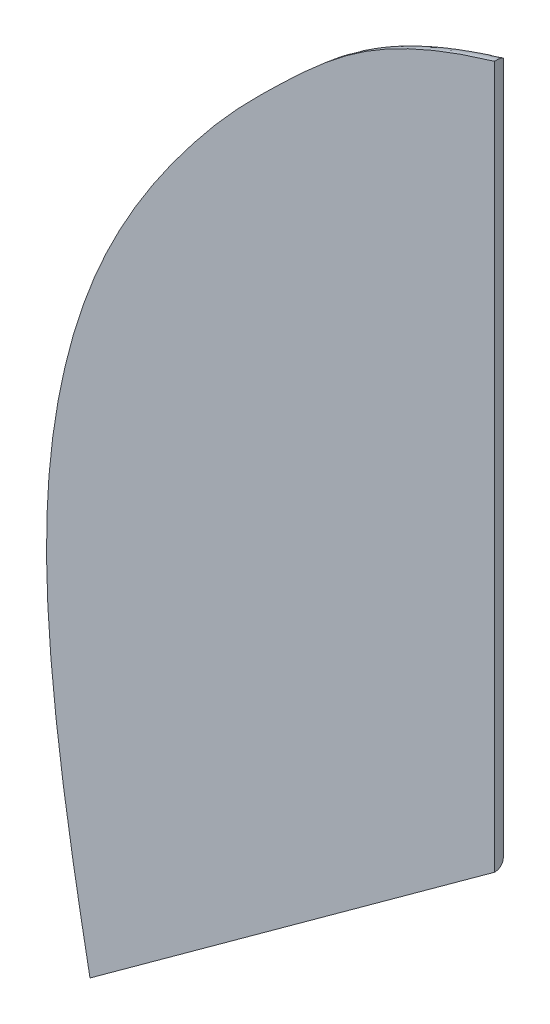
ISO-10303-21;
HEADER;
FILE_DESCRIPTION(('STEP AP214'),'2;1');
FILE_NAME('part.step','',(''),(''),'','','');
FILE_SCHEMA(('AUTOMOTIVE_DESIGN { 1 0 10303 214 1 1 1 1 }'));
ENDSEC;
DATA;
#1=APPLICATION_CONTEXT('core data for automotive mechanical design processes');
#2=APPLICATION_PROTOCOL_DEFINITION('international standard','automotive_design',2000,#1);
#3=PRODUCT_CONTEXT('',#1,'mechanical');
#4=PRODUCT('Part','Part','',(#3));
#5=PRODUCT_RELATED_PRODUCT_CATEGORY('part','',(#4));
#6=PRODUCT_DEFINITION_FORMATION('','',#4);
#7=PRODUCT_DEFINITION_CONTEXT('part definition',#1,'design');
#8=PRODUCT_DEFINITION('design','',#6,#7);
#9=PRODUCT_DEFINITION_SHAPE('','',#8);
#10=(LENGTH_UNIT() NAMED_UNIT(*) SI_UNIT(.MILLI.,.METRE.));
#11=(NAMED_UNIT(*) PLANE_ANGLE_UNIT() SI_UNIT($,.RADIAN.));
#12=(NAMED_UNIT(*) SI_UNIT($,.STERADIAN.) SOLID_ANGLE_UNIT());
#13=UNCERTAINTY_MEASURE_WITH_UNIT(LENGTH_MEASURE(1.E-05),#10,'distance_accuracy_value','');
#14=(GEOMETRIC_REPRESENTATION_CONTEXT(3) GLOBAL_UNCERTAINTY_ASSIGNED_CONTEXT((#13)) GLOBAL_UNIT_ASSIGNED_CONTEXT((#10,
#11,#12)) REPRESENTATION_CONTEXT('',''));
#15=CARTESIAN_POINT('',(0.,0.,0.));
#16=DIRECTION('',(0.,0.,1.));
#17=DIRECTION('',(1.,0.,0.));
#18=AXIS2_PLACEMENT_3D('',#15,#16,#17);
#19=CARTESIAN_POINT('',(94.1657762613478,75.3904488238556,-1.14582738345702));
#20=DIRECTION('',(0.809093584947613,0.587679819769345,-1.52476067888727E-05));
#21=DIRECTION('',(0.587679819967148,-0.809093584675358,2.09895312168286E-05));
#22=AXIS2_PLACEMENT_3D('',#19,#20,#21);
#23=CYLINDRICAL_SURFACE('',#22,0.999999998566137);
#24=DIRECTION('',(0.809093584947609,0.587679819769348,-1.52477245357374E-05));
#25=VECTOR('',#24,1.);
#26=CARTESIAN_POINT('',(85.418228850834,67.800774158147,-1.14563046746204));
#27=LINE('',#26,#25);
#28=CARTESIAN_POINT('',(85.418228842856,67.800774162812,-1.14563046676126));
#29=VERTEX_POINT('',#28);
#30=CARTESIAN_POINT('',(104.088683303602,81.3619363190225,-1.14598231678155));
#31=VERTEX_POINT('',#30);
#32=EDGE_CURVE('E100',#29,#31,#27,.T.);
#33=ORIENTED_EDGE('',*,*,#32,.F.);
#34=CARTESIAN_POINT('',(85.4182288411433,67.8007741511083,-1.14563046676095));
#35=CARTESIAN_POINT('',(85.4182288411324,67.8007730982198,-1.1862123838316));
#36=CARTESIAN_POINT('',(85.4199297827231,67.805060456556,-1.22640162559225));
#37=CARTESIAN_POINT('',(85.426801758126,67.8223832222443,-1.30871260281657));
#38=CARTESIAN_POINT('',(85.4321764377215,67.8359320145512,-1.35000640969398));
#39=CARTESIAN_POINT('',(85.4550592135744,67.8936133582475,-1.48204070055783));
#40=CARTESIAN_POINT('',(85.4788810948432,67.9536578859121,-1.5638862095119));
#41=CARTESIAN_POINT('',(85.5528787986459,68.1401206948168,-1.75547565163697));
#42=CARTESIAN_POINT('',(85.6164289754354,68.3002165090781,-1.86101745475948));
#43=CARTESIAN_POINT('',(85.8117642227431,68.7918076920026,-2.07413345171376));
#44=CARTESIAN_POINT('',(85.9566551174246,69.1560026592058,-2.14469262834904));
#45=CARTESIAN_POINT('',(86.1072257932644,69.5334642203697,-2.14567208972705));
#46=CARTESIAN_POINT('',(86.1082604408169,69.5360575382439,-2.14567548826681));
#47=CARTESIAN_POINT('',(86.1092948111087,69.5386504089863,-2.14567555553839));
#48=(BOUNDED_CURVE() B_SPLINE_CURVE(3,(#34,#35,#36,#37,#38,#39,#40,#41,#42,#43,#44,#45,#46,#47),
.UNSPECIFIED.,.F.,.F.) B_SPLINE_CURVE_WITH_KNOTS((4,2,2,2,2,2,4),(-0.282154770109039,
-0.264045819841401,-0.244498307817385,-0.198964066254299,-0.121078377502086,
1.54265489271666E-13,0.00083747301644812),
.UNSPECIFIED.) CURVE() GEOMETRIC_REPRESENTATION_ITEM() RATIONAL_B_SPLINE_CURVE((1.,1.,1.,1.,1.,
1.,1.,1.,1.,1.,1.,1.,1.,1.)) REPRESENTATION_ITEM(''));
#49=CARTESIAN_POINT('',(86.1092948109795,69.5386504100196,-2.14567555553842));
#50=VERTEX_POINT('',#49);
#51=EDGE_CURVE('E11',#29,#50,#48,.T.);
#52=ORIENTED_EDGE('',*,*,#51,.T.);
#53=DIRECTION('',(-0.809093584947612,-0.587679819769349,1.52475142691568E-05));
#54=VECTOR('',#53,1.);
#55=CARTESIAN_POINT('',(103.08868331038,81.8715179042601,-2.1459955351715));
#56=LINE('',#55,#54);
#57=CARTESIAN_POINT('',(103.088683303841,81.8715178989964,-2.14599553517136));
#58=VERTEX_POINT('',#57);
#59=EDGE_CURVE('E102',#58,#50,#56,.T.);
#60=ORIENTED_EDGE('',*,*,#59,.F.);
#61=CARTESIAN_POINT('',(103.088683303009,81.8715438413148,-1.14599553592001));
#62=DIRECTION('',(-0.454048553797185,-0.890976941486322,2.31162913029494E-05));
#63=DIRECTION('',(0.890976941786197,-0.454048553644391,1.17793068180226E-05));
#64=AXIS2_PLACEMENT_3D('',#61,#62,#63);
#65=ELLIPSE('',#64,1.12236350088156,0.999999999587852);
#66=EDGE_CURVE('E84',#58,#31,#65,.T.);
#67=ORIENTED_EDGE('',*,*,#66,.T.);
#68=EDGE_LOOP('',(#33,#52,#60,#67));
#69=FACE_BOUND('',#68,.T.);
#70=ADVANCED_FACE('F40',(#69),#23,.T.);
#71=CARTESIAN_POINT('',(85.4182288359137,67.8007741786888,-1.14563046641121));
#72=CARTESIAN_POINT('',(85.4182288352536,67.8007482341041,-2.14563046607465));
#73=CARTESIAN_POINT('',(86.4006120316561,67.9876258823196,-2.1456353150438));
#74=CARTESIAN_POINT('',(84.6874237249216,71.6549238684074,-1.14573046024208));
#75=CARTESIAN_POINT('',(84.6874237245498,71.6548979235521,-2.1457304599055));
#76=CARTESIAN_POINT('',(85.6717747044392,71.8324129216093,-2.14573506596585));
#77=CARTESIAN_POINT('',(83.5787432488196,77.7966914906961,-1.14588980511302));
#78=CARTESIAN_POINT('',(83.5787432481835,77.7966655465656,-2.14588980477645));
#79=CARTESIAN_POINT('',(84.5714076116081,77.9341427587359,-2.14589337207847));
#80=CARTESIAN_POINT('',(83.2056041606916,87.4595978575819,-1.14614050475584));
#81=CARTESIAN_POINT('',(83.2056041602353,87.459571912568,-2.14614050441928));
#82=CARTESIAN_POINT('',(84.2145191628218,87.3899093908195,-2.14613869758086));
#83=CARTESIAN_POINT('',(84.9783429344736,95.6294993400638,-1.14635247016296));
#84=CARTESIAN_POINT('',(84.9783429339352,95.6294733959754,-2.14635246982644));
#85=CARTESIAN_POINT('',(85.9256998586979,95.2507333355182,-2.14634264407579));
#86=CARTESIAN_POINT('',(88.2627047097025,101.056520583461,-1.14649327354055));
#87=CARTESIAN_POINT('',(88.2627047091628,101.056494638617,-2.14649327320399));
#88=CARTESIAN_POINT('',(89.0962276088147,100.500859782968,-2.14647885793674));
#89=CARTESIAN_POINT('',(90.3592168655045,103.780432607108,-1.1465639453254));
#90=CARTESIAN_POINT('',(90.3592168649905,103.78040666263,-2.14656394498887));
#91=CARTESIAN_POINT('',(91.1381068468186,103.153073441316,-2.14654766951083));
#92=CARTESIAN_POINT('',(91.5681859948089,105.266187251436,-1.14660249320236));
#93=CARTESIAN_POINT('',(91.5681859942821,105.266161306808,-2.14660249286579));
#94=CARTESIAN_POINT('',(92.3345878296822,104.621977642148,-2.14658578020392));
#95=CARTESIAN_POINT('',(92.6564039971488,106.41628000436,-1.14663233241689));
#96=CARTESIAN_POINT('',(92.6564039966324,106.416254059839,-2.14663233208036));
#97=CARTESIAN_POINT('',(93.3532797674012,105.697229915292,-2.14661367767915));
#98=CARTESIAN_POINT('',(93.3094159967624,107.056283775076,-1.14664893737178));
#99=CARTESIAN_POINT('',(93.3094159962421,107.056257830518,-2.14664893703524));
#100=CARTESIAN_POINT('',(94.0259523821954,106.358708113811,-2.14663083978878));
#101=(BOUNDED_SURFACE() B_SPLINE_SURFACE(3,2,((#71,#72,#73),(#74,#75,#76),(#77,#78,#79),(#80,
#81,#82),(#83,#84,#85),(#86,#87,#88),(#89,#90,#91),(#92,#93,#94),(#95,#96,#97),(#98,#99,#100)),
.UNSPECIFIED.,.F.,.F.,.F.) B_SPLINE_SURFACE_WITH_KNOTS((4,1,1,1,1,1,1,4),(3,3),(0.,
11.7431313152028,18.5717809273118,28.2978183978038,35.5405647191903,36.7544778082343,
38.3796799892132,41.2057858997997),(0.,1.57079632700827),
.UNSPECIFIED.) GEOMETRIC_REPRESENTATION_ITEM() RATIONAL_B_SPLINE_SURFACE(((1.,0.70710678111111,
1.),(1.,0.707106781237663,1.),(1.,0.707106781161074,1.),(1.,0.707106781197957,1.),(1.,
0.707106781177582,1.),(1.,0.707106781187554,1.),(1.,0.70710678118583,1.),(1.,0.707106781187182,
1.),(1.,0.707106781186161,1.),(1.,0.707106781186557,1.))) REPRESENTATION_ITEM('') SURFACE());
#102=CARTESIAN_POINT('',(93.3094156821917,107.056283466772,-1.14664893736378));
#103=CARTESIAN_POINT('',(92.6564037752666,106.416279769862,-1.1466323324108));
#104=CARTESIAN_POINT('',(91.5681858979672,105.266187132423,-1.14660249319927));
#105=CARTESIAN_POINT('',(90.3592168655045,103.780432607108,-1.1465639453254));
#106=CARTESIAN_POINT('',(88.2627047097025,101.056520583461,-1.14649327354055));
#107=CARTESIAN_POINT('',(84.9783429344736,95.6294993400638,-1.14635247016296));
#108=CARTESIAN_POINT('',(83.2056041606916,87.4595978575819,-1.14614050475584));
#109=CARTESIAN_POINT('',(83.5787432488196,77.7966914906961,-1.14588980511302));
#110=CARTESIAN_POINT('',(84.6874237249216,71.6549238684074,-1.14573046024208));
#111=CARTESIAN_POINT('',(85.4182288359137,67.8007741786888,-1.14563046641121));
#112=(BOUNDED_CURVE() B_SPLINE_CURVE(3,(#102,#103,#104,#105,#106,#107,#108,#109,#110,#111),
.UNSPECIFIED.,.F.,.F.) B_SPLINE_CURVE_WITH_KNOTS((4,1,1,1,1,1,1,4),(-41.2057854460001,
-38.3796799892132,-36.7544778082343,-35.5405647191903,-28.2978183978038,-18.5717809273118,
-11.7431313152028,0.),
.UNSPECIFIED.) CURVE() GEOMETRIC_REPRESENTATION_ITEM() RATIONAL_B_SPLINE_CURVE((1.,1.,1.,1.,1.,
1.,1.,1.,1.,1.)) REPRESENTATION_ITEM(''));
#113=CARTESIAN_POINT('',(93.309416154745,107.056283927313,-1.14664896070818));
#114=VERTEX_POINT('',#113);
#115=EDGE_CURVE('E91',#114,#29,#112,.T.);
#116=CARTESIAN_POINT('',(93.9815993480781,106.315025264482,-2.14662969577671));
#117=CARTESIAN_POINT('',(93.9714588716262,106.325896259986,-2.14662804886552));
#118=CARTESIAN_POINT('',(93.9613155748412,106.336764573075,-2.14629459054913));
#119=CARTESIAN_POINT('',(93.94086604954,106.358666218738,-2.14495404255986));
#120=CARTESIAN_POINT('',(93.9305600953074,106.369699089203,-2.14393520062723));
#121=CARTESIAN_POINT('',(93.9098146053023,106.391899958916,-2.14119112521859));
#122=CARTESIAN_POINT('',(93.8993757131778,106.4030671376,-2.13945437840774));
#123=CARTESIAN_POINT('',(93.8783967001421,106.425503659447,-2.13524504183108));
#124=CARTESIAN_POINT('',(93.8678575750622,106.436771840788,-2.13276129130452));
#125=CARTESIAN_POINT('',(93.8467133309381,106.459374471329,-2.12703196377108));
#126=CARTESIAN_POINT('',(93.8361095329517,106.470707444762,-2.12377568583686));
#127=CARTESIAN_POINT('',(93.8148738411924,106.493401048192,-2.11647952379355));
#128=CARTESIAN_POINT('',(93.8042435560397,106.504759926437,-2.11242950670931));
#129=CARTESIAN_POINT('',(93.7829951705572,106.527464301106,-2.10352884321157));
#130=CARTESIAN_POINT('',(93.7723789180922,106.538807818446,-2.0986687352244));
#131=CARTESIAN_POINT('',(93.7512009075342,106.561438365362,-2.08813617876024));
#132=CARTESIAN_POINT('',(93.7406411778623,106.572723247553,-2.08245503642786));
#133=CARTESIAN_POINT('',(93.7196201314753,106.595191779052,-2.0702744954366));
#134=CARTESIAN_POINT('',(93.7091609554439,106.606373181319,-2.06376725648495));
#135=CARTESIAN_POINT('',(93.6883860605652,106.62858885895,-2.04993480937024));
#136=CARTESIAN_POINT('',(93.6780725179508,106.639620864645,-2.0426026868165));
#137=CARTESIAN_POINT('',(93.6576345285181,106.661491255367,-2.02712727370698));
#138=CARTESIAN_POINT('',(93.6475122100425,106.67232743188,-2.01897805067642));
#139=CARTESIAN_POINT('',(93.6275023072291,106.693759646381,-2.00188194840795));
#140=CARTESIAN_POINT('',(93.6176167150635,106.704353625352,-1.99293015587576));
#141=CARTESIAN_POINT('',(93.5981253587314,106.725255570835,-1.97424922028004));
#142=CARTESIAN_POINT('',(93.5885213603383,106.735561718719,-1.9645161998496));
#143=CARTESIAN_POINT('',(93.5696368847425,106.755843216489,-1.944299815591));
#144=CARTESIAN_POINT('',(93.5603578558442,106.765817077711,-1.93381360518453));
#145=CARTESIAN_POINT('',(93.542165881639,106.785391637428,-1.91212447992436));
#146=CARTESIAN_POINT('',(93.5332539822707,106.794991266067,-1.90091972249618));
#147=CARTESIAN_POINT('',(93.515833778158,106.813775383132,-1.87783296705895));
#148=CARTESIAN_POINT('',(93.5073260306491,106.822959297603,-1.86595008103622));
#149=CARTESIAN_POINT('',(93.492008306886,106.839528872561,-1.8433940964545));
#150=CARTESIAN_POINT('',(93.4851358429926,106.846976789312,-1.83280896308812));
#151=CARTESIAN_POINT('',(93.4715803597666,106.86170851418,-1.81095820079035));
#152=CARTESIAN_POINT('',(93.4649052052898,106.868984736004,-1.79968256982055));
#153=CARTESIAN_POINT('',(93.451787509738,106.88332595529,-1.77645664164651));
#154=CARTESIAN_POINT('',(93.4453528647485,106.890383240249,-1.76449712279867));
#155=CARTESIAN_POINT('',(93.4327619888395,106.904240840383,-1.73991588467534));
#156=CARTESIAN_POINT('',(93.4266136221462,106.911033472798,-1.72728580440369));
#157=CARTESIAN_POINT('',(93.4146407120792,106.924315294137,-1.70138314663649));
#158=CARTESIAN_POINT('',(93.4088238741881,106.930796936242,-1.68810313676013));
#159=CARTESIAN_POINT('',(93.3975590196121,106.943411030311,-1.66092771698521));
#160=CARTESIAN_POINT('',(93.3921184280641,106.94953620094,-1.6470258484573));
#161=CARTESIAN_POINT('',(93.3816497378227,106.96139286809,-1.61864128929788));
#162=CARTESIAN_POINT('',(93.3766286538534,106.967117479001,-1.60415313456556));
#163=CARTESIAN_POINT('',(93.3670406178379,106.978130634682,-1.57463795182669));
#164=CARTESIAN_POINT('',(93.3624801396643,106.983412821485,-1.55960644782165));
#165=CARTESIAN_POINT('',(93.3538521480573,106.993501587321,-1.52905359912258));
#166=CARTESIAN_POINT('',(93.3497904400037,106.998302464092,-1.51352873166508));
#167=CARTESIAN_POINT('',(93.3421952817737,107.007392674538,-1.48204479577365));
#168=CARTESIAN_POINT('',(93.3386668483583,107.011677081626,-1.46608309437629));
#169=CARTESIAN_POINT('',(93.3321693045771,107.019702723062,-1.43378707791714));
#170=CARTESIAN_POINT('',(93.3292043141341,107.023439913784,-1.41745092894498));
#171=CARTESIAN_POINT('',(93.3238598782128,107.030344426866,-1.38447272247191));
#172=CARTESIAN_POINT('',(93.3214835636738,107.033508679,-1.36782951466867));
#173=CARTESIAN_POINT('',(93.3173373541681,107.039246066048,-1.33430803378677));
#174=CARTESIAN_POINT('',(93.3155695287923,107.041817173976,-1.3174291577569));
#175=CARTESIAN_POINT('',(93.312655392425,107.046352916411,-1.28351022562433));
#176=CARTESIAN_POINT('',(93.3115100398294,107.048316613722,-1.26646996184474));
#177=CARTESIAN_POINT('',(93.309850045144,107.051628175925,-1.23230398678629));
#178=CARTESIAN_POINT('',(93.309335225087,107.052976214518,-1.21517830098859));
#179=CARTESIAN_POINT('',(93.3089389496584,107.055053817754,-1.18091787224343));
#180=CARTESIAN_POINT('',(93.3090561807014,107.05578466145,-1.16378322202576));
#181=CARTESIAN_POINT('',(93.3094899818704,107.056207983369,-1.14664895095912));
#182=B_SPLINE_CURVE_WITH_KNOTS('',3,(#116,#117,#118,#119,#120,#121,#122,#123,#124,#125,#126,
#127,#128,#129,#130,#131,#132,#133,#134,#135,#136,#137,#138,#139,#140,#141,#142,#143,#144,#145,
#146,#147,#148,#149,#150,#151,#152,#153,#154,#155,#156,#157,#158,#159,#160,#161,#162,#163,#164,
#165,#166,#167,#168,#169,#170,#171,#172,#173,#174,#175,#176,#177,#178,#179,#180,#181),
.UNSPECIFIED.,.F.,.F.,(4,2,2,2,2,2,2,2,2,2,2,2,2,2,2,2,2,2,2,2,2,2,2,2,2,2,2,2,2,2,2,2,4),(0.,
0.0445953372710588,0.0899755282176509,0.136113618359032,0.182978522686478,0.230534980957764,
0.278743561414143,0.327560717430951,0.376938900676757,0.426826733183175,0.477169239333119,
0.527908137211212,0.578982187071989,0.630327592944317,0.681878451680931,0.733567242166006,
0.785325345990893,0.82927447672095,0.874223280576148,0.92012191046948,0.966914555699282,
1.01453953907218,1.06292951411201,1.11201176643389,1.16170862031835,1.21193794810426,
1.2626137763879,1.31364697935826,1.36494604612267,1.41641790579956,1.46796879167588,
1.51950512401492,1.57093439027497),.UNSPECIFIED.);
#183=CARTESIAN_POINT('',(93.9816134857898,106.315011061286,-2.14662970606499));
#184=VERTEX_POINT('',#183);
#185=EDGE_CURVE('E53',#184,#114,#182,.T.);
#186=CARTESIAN_POINT('',(86.1092948109284,69.5386504105194,-2.14567555553843));
#187=CARTESIAN_POINT('',(85.4910047392888,72.8702531569204,-2.14576199217823));
#188=CARTESIAN_POINT('',(84.5515024362378,78.4615307807123,-2.14590705491737));
#189=CARTESIAN_POINT('',(84.2145191628218,87.3899093908195,-2.14613869758086));
#190=CARTESIAN_POINT('',(85.9256998586979,95.2507333355182,-2.14634264407579));
#191=CARTESIAN_POINT('',(89.0962276088147,100.500859782968,-2.14647885793674));
#192=CARTESIAN_POINT('',(91.1381068468186,103.153073441316,-2.14654766951083));
#193=CARTESIAN_POINT('',(92.3214582950049,104.605858682534,-2.1465853619978));
#194=CARTESIAN_POINT('',(93.3248409457968,105.667180529512,-2.14661289804632));
#195=CARTESIAN_POINT('',(93.9815988498148,106.315024772984,-2.14662970642072));
#196=(BOUNDED_CURVE() B_SPLINE_CURVE(3,(#186,#187,#188,#189,#190,#191,#192,#193,#194,#195),
.UNSPECIFIED.,.F.,.F.) B_SPLINE_CURVE_WITH_KNOTS((4,1,1,1,1,1,1,4),(1.57828878944918,
11.7431313152028,18.5717809273118,28.2978183978038,35.5405647191903,36.7544778082343,
38.3796799892132,41.1436188290223),
.UNSPECIFIED.) CURVE() GEOMETRIC_REPRESENTATION_ITEM() RATIONAL_B_SPLINE_CURVE((1.,1.,1.,1.,1.,
1.,1.,1.,1.,1.)) REPRESENTATION_ITEM(''));
#197=EDGE_CURVE('E94',#50,#184,#196,.T.);
#198=ORIENTED_EDGE('',*,*,#115,.F.);
#199=ORIENTED_EDGE('',*,*,#185,.F.);
#200=ORIENTED_EDGE('',*,*,#197,.F.);
#201=ORIENTED_EDGE('',*,*,#51,.F.);
#202=EDGE_LOOP('',(#198,#199,#200,#201));
#203=FACE_BOUND('',#202,.T.);
#204=ADVANCED_FACE('F90',(#203),#101,.T.);
#205=CARTESIAN_POINT('',(93.2810531994021,107.028453714624,-1.14664821531906));
#206=CARTESIAN_POINT('',(93.2810531988814,107.028427770066,-2.14664821498221));
#207=CARTESIAN_POINT('',(93.981700989443,106.314920466362,-2.14662970371459));
#208=CARTESIAN_POINT('',(94.0419259656613,107.770926932868,-1.14666747884023));
#209=CARTESIAN_POINT('',(94.0419259680544,107.770900989942,-2.14666747851056));
#210=CARTESIAN_POINT('',(94.7390243973124,107.054489101526,-2.14664889189014));
#211=CARTESIAN_POINT('',(95.5088276315616,109.224536377912,-1.14670519288493));
#212=CARTESIAN_POINT('',(95.5088276240185,109.224510430334,-2.14670519254188));
#213=CARTESIAN_POINT('',(96.1978422311892,108.497032386181,-2.1466863187974));
#214=CARTESIAN_POINT('',(97.6505934799135,110.960440522982,-1.14675023124762));
#215=CARTESIAN_POINT('',(97.6505934863445,110.960414580264,-2.14675023091358));
#216=CARTESIAN_POINT('',(98.2245926104887,110.135851468104,-2.146728838289));
#217=CARTESIAN_POINT('',(100.515930402757,112.596035261685,-1.14679266753042));
#218=CARTESIAN_POINT('',(100.515930393818,112.596009316956,-2.14679266719183));
#219=CARTESIAN_POINT('',(100.910276250548,111.670007568443,-2.14676864268861));
#220=CARTESIAN_POINT('',(102.558545091204,113.331103058233,-1.14681173959532));
#221=CARTESIAN_POINT('',(102.558545099639,113.331077110214,-2.14681173926018));
#222=CARTESIAN_POINT('',(102.887578141634,112.38724402614,-2.14678725210043));
#223=CARTESIAN_POINT('',(104.088683302649,113.78436227721,-1.14682350000457));
#224=CARTESIAN_POINT('',(104.088683299613,113.784336341266,-2.14682349966828));
#225=CARTESIAN_POINT('',(104.369046277608,112.824442284638,-2.14679859578689));
#226=(BOUNDED_SURFACE() B_SPLINE_SURFACE(3,2,((#205,#206,#207),(#208,#209,#210),(#211,#212,
#213),(#214,#215,#216),(#217,#218,#219),(#220,#221,#222),(#223,#224,#225)),.UNSPECIFIED.,.F.,
.F.,.F.) B_SPLINE_SURFACE_WITH_KNOTS((4,1,1,1,4),(3,3),(-0.039184145587453,3.13560186252464,
6.11713441541781,7.7551572769279,12.3936851884312),(0.,1.57079634025523),
.UNSPECIFIED.) GEOMETRIC_REPRESENTATION_ITEM() RATIONAL_B_SPLINE_SURFACE(((1.,0.707106781186177,
1.),(1.,0.707106781260901,1.),(1.,0.707106780769376,1.),(1.,0.707106781838213,1.),(1.,
0.707106779779989,1.),(1.,0.707106784361231,1.),(1.,0.7071067764276,1.))) REPRESENTATION_ITEM('') SURFACE());
#227=CARTESIAN_POINT('',(104.088683302339,113.784362277118,-1.14682350000457));
#228=CARTESIAN_POINT('',(102.558545091,113.331103058159,-1.14681173959532));
#229=CARTESIAN_POINT('',(100.51593040266,112.59603526163,-1.14679266753041));
#230=CARTESIAN_POINT('',(97.6505934799135,110.960440522982,-1.14675023124762));
#231=CARTESIAN_POINT('',(95.5196963893886,109.233345520974,-1.14670542143982));
#232=CARTESIAN_POINT('',(94.0607846319439,107.789602112692,-1.14666796336968));
#233=CARTESIAN_POINT('',(93.309489742723,107.05620774992,-1.14664893539952));
#234=(BOUNDED_CURVE() B_SPLINE_CURVE(3,(#227,#228,#229,#230,#231,#232,#233),.UNSPECIFIED.,.F.,
.F.) B_SPLINE_CURVE_WITH_KNOTS((4,1,1,1,4),(-12.393685188118,-7.7551572769279,-6.11713441541781,
-3.13560186252464,-0.000369575659607166),
.UNSPECIFIED.) CURVE() GEOMETRIC_REPRESENTATION_ITEM() RATIONAL_B_SPLINE_CURVE((1.,1.,1.,1.,1.,
1.,1.)) REPRESENTATION_ITEM(''));
#235=CARTESIAN_POINT('',(104.088683302527,113.784362276803,-1.14682350017392));
#236=VERTEX_POINT('',#235);
#237=EDGE_CURVE('E101',#236,#114,#234,.T.);
#238=CARTESIAN_POINT('',(104.088683302649,113.78436227721,-1.14682350000457));
#239=CARTESIAN_POINT('',(104.088683302509,113.784362213854,-1.14929081303583));
#240=CARTESIAN_POINT('',(104.088674170937,113.784349920416,-1.15175809857638));
#241=CARTESIAN_POINT('',(104.088637664549,113.784300902493,-1.15669035868818));
#242=CARTESIAN_POINT('',(104.088610304031,113.784264197156,-1.15915533355555));
#243=CARTESIAN_POINT('',(104.088500957855,113.784117573047,-1.1665444199645));
#244=CARTESIAN_POINT('',(104.08839170749,113.783971145933,-1.17146748435638));
#245=CARTESIAN_POINT('',(104.088114363878,113.783599472788,-1.18084503680504));
#246=CARTESIAN_POINT('',(104.087952767341,113.783382929757,-1.18530007001719));
#247=CARTESIAN_POINT('',(104.087531016441,113.782817869199,-1.19511555567945));
#248=CARTESIAN_POINT('',(104.087257448761,113.782451397043,-1.20047439461742));
#249=CARTESIAN_POINT('',(104.086416571004,113.781324883467,-1.21470080827836));
#250=CARTESIAN_POINT('',(104.085774433342,113.780464556044,-1.22355641488282));
#251=CARTESIAN_POINT('',(104.084558999274,113.778836624092,-1.23770689544613));
#252=CARTESIAN_POINT('',(104.084059548783,113.778167762713,-1.24301989918416));
#253=CARTESIAN_POINT('',(104.082975630666,113.776715677629,-1.25364418647796));
#254=CARTESIAN_POINT('',(104.082390820238,113.775931992747,-1.25895537219313));
#255=CARTESIAN_POINT('',(104.080742648353,113.773723663326,-1.27289605769432));
#256=CARTESIAN_POINT('',(104.07961029923,113.772206779473,-1.28150302036225));
#257=CARTESIAN_POINT('',(104.077119126918,113.768869934443,-1.29870967680758));
#258=CARTESIAN_POINT('',(104.075758290837,113.767047279661,-1.30730855480017));
#259=CARTESIAN_POINT('',(104.073108408869,113.763497259094,-1.32275610966393));
#260=CARTESIAN_POINT('',(104.071856124084,113.761819296452,-1.32962252880984));
#261=CARTESIAN_POINT('',(104.069206909035,113.758269032114,-1.34334007934334));
#262=CARTESIAN_POINT('',(104.067808858906,113.756395225499,-1.35019060497538));
#263=CARTESIAN_POINT('',(104.064868551091,113.752453598998,-1.363871698268));
#264=CARTESIAN_POINT('',(104.063325144629,113.750384233039,-1.37070157379006));
#265=CARTESIAN_POINT('',(104.060227944397,113.746232553655,-1.38376718853273));
#266=CARTESIAN_POINT('',(104.058683556266,113.744162777861,-1.39000916768522));
#267=CARTESIAN_POINT('',(104.05383252704,113.737662631748,-1.40883392676184));
#268=CARTESIAN_POINT('',(104.050355719002,113.733005407171,-1.42129572577061));
#269=CARTESIAN_POINT('',(104.042904025324,113.723019731622,-1.4461662793413));
#270=CARTESIAN_POINT('',(104.038919218282,113.717677894087,-1.45856664131862));
#271=CARTESIAN_POINT('',(104.03045297274,113.706321793757,-1.48328589186833));
#272=CARTESIAN_POINT('',(104.02596174732,113.700294247546,-1.4955953150937));
#273=CARTESIAN_POINT('',(104.016483248028,113.687568157706,-1.52010193414993));
#274=CARTESIAN_POINT('',(104.011486385208,113.680856613506,-1.53228864496744));
#275=CARTESIAN_POINT('',(104.001000010497,113.666765982003,-1.55652138385016));
#276=CARTESIAN_POINT('',(103.995501241637,113.659374313625,-1.56855607920159));
#277=CARTESIAN_POINT('',(103.984886030535,113.645118871242,-1.59060791211445));
#278=CARTESIAN_POINT('',(103.979813435014,113.63831221534,-1.60068328574083));
#279=CARTESIAN_POINT('',(103.969245630153,113.624141769252,-1.62080774367506));
#280=CARTESIAN_POINT('',(103.963741951471,113.616766948341,-1.63084460190723));
#281=CARTESIAN_POINT('',(103.952317543599,113.601454168102,-1.65086975789118));
#282=CARTESIAN_POINT('',(103.946389045993,113.593505657442,-1.66084553282882));
#283=CARTESIAN_POINT('',(103.934116909756,113.577040752131,-1.68072374113274));
#284=CARTESIAN_POINT('',(103.92776604602,113.56851430541,-1.6906133711392));
#285=CARTESIAN_POINT('',(103.914651748855,113.550890478218,-1.71029404028455));
#286=CARTESIAN_POINT('',(103.907881619626,113.541783569495,-1.72007206774456));
#287=CARTESIAN_POINT('',(103.893930757705,113.522997499112,-1.73950342959048));
#288=CARTESIAN_POINT('',(103.886743801382,113.513309350418,-1.7491435910184));
#289=CARTESIAN_POINT('',(103.871960980265,113.493361328669,-1.76827260373646));
#290=CARTESIAN_POINT('',(103.864359318745,113.483093024253,-1.77774816759642));
#291=CARTESIAN_POINT('',(103.848748277279,113.461987189655,-1.79652093658931));
#292=CARTESIAN_POINT('',(103.840733477237,113.451141796482,-1.80580477911711));
#293=CARTESIAN_POINT('',(103.824297234825,113.428886157086,-1.82416707814867));
#294=CARTESIAN_POINT('',(103.815870713172,113.417468621723,-1.83323214031691));
#295=CARTESIAN_POINT('',(103.798610408152,113.394075633604,-1.85112914853215));
#296=CARTESIAN_POINT('',(103.789771809116,113.382093486966,-1.859947683026));
#297=CARTESIAN_POINT('',(103.77169102216,113.357578294055,-1.87732706000544));
#298=CARTESIAN_POINT('',(103.762444373666,113.345039099335,-1.88587458666143));
#299=CARTESIAN_POINT('',(103.745803307112,113.322502503792,-1.90065883400659));
#300=CARTESIAN_POINT('',(103.738442804269,113.312544574065,-1.90699422418763));
#301=CARTESIAN_POINT('',(103.723216856502,113.291961274095,-1.9197048224363));
#302=CARTESIAN_POINT('',(103.715345956924,113.281329389869,-1.92606294485291));
#303=CARTESIAN_POINT('',(103.699107886367,113.259386757631,-1.93878369892656));
#304=CARTESIAN_POINT('',(103.690736217079,113.248069490282,-1.94512932204223));
#305=CARTESIAN_POINT('',(103.67350093547,113.224748306678,-1.95778549048273));
#306=CARTESIAN_POINT('',(103.664633394825,113.212738015808,-1.96407892870172));
#307=CARTESIAN_POINT('',(103.646411435142,113.188025238126,-1.97658983717013));
#308=CARTESIAN_POINT('',(103.637053584419,113.17531657662,-1.9827900998527));
#309=CARTESIAN_POINT('',(103.617855129828,113.149204621325,-1.99507188818868));
#310=CARTESIAN_POINT('',(103.608011456494,113.13579543595,-2.00113607902578));
#311=CARTESIAN_POINT('',(103.587844914244,113.108283242617,-2.01310164169912));
#312=CARTESIAN_POINT('',(103.577519244035,113.094174699013,-2.01898555408993));
#313=CARTESIAN_POINT('',(103.556391153716,113.06526838643,-2.03054537368484));
#314=CARTESIAN_POINT('',(103.545586101957,113.050465518093,-2.0362037079686));
#315=CARTESIAN_POINT('',(103.523501633677,113.020178408157,-2.04726692181594));
#316=CARTESIAN_POINT('',(103.512219714489,113.004689548326,-2.05265415657772));
#317=CARTESIAN_POINT('',(103.489179225577,112.97304485564,-2.06312843143992));
#318=CARTESIAN_POINT('',(103.477418083779,112.956885039891,-2.06819775260413));
#319=CARTESIAN_POINT('',(103.453429799451,112.923907372815,-2.07799470281482));
#320=CARTESIAN_POINT('',(103.4412004546,112.907085889564,-2.08270476030884));
#321=CARTESIAN_POINT('',(103.423889318194,112.883342006773,-2.08895742663303));
#322=CARTESIAN_POINT('',(103.418854584411,112.876444378103,-2.09072693497641));
#323=CARTESIAN_POINT('',(103.406437394842,112.859430624041,-2.09497974726252));
#324=CARTESIAN_POINT('',(103.399049459258,112.849306018198,-2.09741332216692));
#325=CARTESIAN_POINT('',(103.381944635893,112.825829088426,-2.10283710096879));
#326=CARTESIAN_POINT('',(103.372225923393,112.812462922971,-2.1057617061673));
#327=CARTESIAN_POINT('',(103.350477985301,112.782504106141,-2.11195715211916));
#328=CARTESIAN_POINT('',(103.338446198614,112.765896377506,-2.1151461682222));
#329=CARTESIAN_POINT('',(103.312093096302,112.729472009187,-2.12161283904189));
#330=CARTESIAN_POINT('',(103.297767931205,112.709640885442,-2.12479378500334));
#331=CARTESIAN_POINT('',(103.275405528446,112.678684378452,-2.12924061849491));
#332=CARTESIAN_POINT('',(103.267383634723,112.667579789831,-2.13073208370089));
#333=CARTESIAN_POINT('',(103.25307644825,112.64776915135,-2.13321089185874));
#334=CARTESIAN_POINT('',(103.246792912377,112.639066710613,-2.13423732727049));
#335=CARTESIAN_POINT('',(103.228620811306,112.613880410101,-2.13702925629148));
#336=CARTESIAN_POINT('',(103.216731740394,112.597379186769,-2.13863737060337));
#337=CARTESIAN_POINT('',(103.193842886722,112.565591183253,-2.14131478286429));
#338=CARTESIAN_POINT('',(103.182843640335,112.550306642525,-2.14241556433675));
#339=CARTESIAN_POINT('',(103.161727485273,112.520951245671,-2.14417570265934));
#340=CARTESIAN_POINT('',(103.151610909454,112.506881852322,-2.14486348554575));
#341=CARTESIAN_POINT('',(103.132254190175,112.479951311526,-2.14588462306215));
#342=CARTESIAN_POINT('',(103.123014066098,112.467091112364,-2.14624352614654));
#343=CARTESIAN_POINT('',(103.105408706783,112.442567392803,-2.14668390232996));
#344=CARTESIAN_POINT('',(103.097042731897,112.430904810799,-2.14678824699519));
#345=CARTESIAN_POINT('',(103.088683302486,112.419237566732,-2.14678808226334));
#346=B_SPLINE_CURVE_WITH_KNOTS('',3,(#238,#239,#240,#241,#242,#243,#244,#245,#246,#247,#248,
#249,#250,#251,#252,#253,#254,#255,#256,#257,#258,#259,#260,#261,#262,#263,#264,#265,#266,#267,
#268,#269,#270,#271,#272,#273,#274,#275,#276,#277,#278,#279,#280,#281,#282,#283,#284,#285,#286,
#287,#288,#289,#290,#291,#292,#293,#294,#295,#296,#297,#298,#299,#300,#301,#302,#303,#304,#305,
#306,#307,#308,#309,#310,#311,#312,#313,#314,#315,#316,#317,#318,#319,#320,#321,#322,#323,#324,
#325,#326,#327,#328,#329,#330,#331,#332,#333,#334,#335,#336,#337,#338,#339,#340,#341,#342,#343,
#344,#345),.UNSPECIFIED.,.F.,.F.,(4,2,2,2,2,2,2,2,2,2,2,2,2,2,2,2,2,2,2,2,2,2,2,2,2,2,2,2,2,2,2,
2,2,2,2,2,2,2,2,2,2,2,2,2,2,2,2,2,2,2,2,2,2,4),(0.,0.00740183759267276,0.0147978762148397,
0.0295755842796773,0.042964161166394,0.0590974208084208,0.0858487865494316,0.101981727445609,
0.118181337303439,0.144610966149264,0.171286984896221,0.192818838515272,0.214530376856681,
0.236430803691105,0.256693691577637,0.297919874895489,0.340131778142893,0.383379460430007,
0.42770749884308,0.473155446473915,0.512668340815813,0.553507072963508,0.595692919092456,
0.639242942398777,0.684170398889914,0.730485114054773,0.778193833296115,0.827300549214282,
0.877806808724015,0.929712002674517,0.983013640222033,1.0247381311448,1.06876451119506,
1.11508365655541,1.16368316497295,1.2145474750913,1.26765797009989,1.32299308043822,
1.38052839716441,1.44023680511461,1.50208864286019,1.56605189452727,1.59221475546082,
1.63051611642732,1.68086140774059,1.74311965004035,1.81711939579463,1.85845790633034,
1.89080571821609,1.95200545311715,2.00859090214684,2.06061593171248,2.10813271094338,
2.15119096405578),.UNSPECIFIED.);
#347=CARTESIAN_POINT('',(103.088683302474,112.419237566613,-2.14678808226333));
#348=VERTEX_POINT('',#347);
#349=EDGE_CURVE('E62',#236,#348,#346,.T.);
#350=CARTESIAN_POINT('',(93.9817010220059,106.314920498161,-2.14662970371541));
#351=CARTESIAN_POINT('',(94.7390244188772,107.05448912285,-2.14664889189069));
#352=CARTESIAN_POINT('',(96.1978422430211,108.497032395748,-2.14668631879765));
#353=CARTESIAN_POINT('',(98.2245926104887,110.135851468104,-2.146728838289));
#354=CARTESIAN_POINT('',(100.520613755711,111.447418770339,-2.14676286751784));
#355=CARTESIAN_POINT('',(102.048423170036,112.065466062398,-2.1467789032767));
#356=CARTESIAN_POINT('',(103.088683302119,112.419237566607,-2.14678808226333));
#357=(BOUNDED_CURVE() B_SPLINE_CURVE(3,(#350,#351,#352,#353,#354,#355,#356),.UNSPECIFIED.,.F.,
.F.) B_SPLINE_CURVE_WITH_KNOTS((4,1,1,1,4),(-0.0391841000850612,3.13560186252464,
6.11713441541781,7.7551572769279,11.050441407826),
.UNSPECIFIED.) CURVE() GEOMETRIC_REPRESENTATION_ITEM() RATIONAL_B_SPLINE_CURVE((1.,1.,1.,1.,1.,
1.,1.)) REPRESENTATION_ITEM(''));
#358=EDGE_CURVE('E127',#184,#348,#357,.T.);
#359=ORIENTED_EDGE('',*,*,#237,.F.);
#360=ORIENTED_EDGE('',*,*,#349,.T.);
#361=ORIENTED_EDGE('',*,*,#358,.F.);
#362=ORIENTED_EDGE('',*,*,#185,.T.);
#363=EDGE_LOOP('',(#359,#360,#361,#362));
#364=FACE_BOUND('',#363,.T.);
#365=ADVANCED_FACE('F42',(#364),#226,.T.);
#366=CARTESIAN_POINT('',(103.088683303007,97.5731493050074,-1.1464029071374));
#367=DIRECTION('',(0.,-0.99999999966344,2.59445582280542E-05));
#368=DIRECTION('',(-8.78053186077432E-10,-2.59445582280542E-05,-0.99999999966344));
#369=AXIS2_PLACEMENT_3D('',#366,#367,#368);
#370=CYLINDRICAL_SURFACE('',#369,0.999999999587852);
#371=DIRECTION('',(-1.35006801008479E-10,0.99999999966344,-2.59445582298336E-05));
#372=VECTOR('',#371,1.);
#373=CARTESIAN_POINT('',(103.088683306598,81.8715179089925,-2.14599553517162));
#374=LINE('',#373,#372);
#375=EDGE_CURVE('E133',#58,#348,#374,.T.);
#376=ORIENTED_EDGE('',*,*,#375,.T.);
#377=ORIENTED_EDGE('',*,*,#349,.F.);
#378=DIRECTION('',(0.,0.99999999966344,-2.59445578540692E-05));
#379=VECTOR('',#378,1.);
#380=CARTESIAN_POINT('',(104.08868330265,81.3619363328047,-1.14598231485036));
#381=LINE('',#380,#379);
#382=EDGE_CURVE('E104',#31,#236,#381,.T.);
#383=ORIENTED_EDGE('',*,*,#382,.F.);
#384=ORIENTED_EDGE('',*,*,#66,.F.);
#385=EDGE_LOOP('',(#376,#377,#383,#384));
#386=FACE_BOUND('',#385,.T.);
#387=ADVANCED_FACE('F183',(#386),#370,.T.);
#388=CARTESIAN_POINT('',(83.4160170765182,61.6063518281539,-2.14546975415462));
#389=DIRECTION('',(-5.2028532899658E-10,-2.59445582298355E-05,-0.99999999966344));
#390=DIRECTION('',(0.,-0.99999999966344,2.59445582298355E-05));
#391=AXIS2_PLACEMENT_3D('',#388,#389,#390);
#392=PLANE('',#391);
#393=ORIENTED_EDGE('',*,*,#59,.T.);
#394=ORIENTED_EDGE('',*,*,#197,.T.);
#395=ORIENTED_EDGE('',*,*,#358,.T.);
#396=ORIENTED_EDGE('',*,*,#375,.F.);
#397=EDGE_LOOP('',(#393,#394,#395,#396));
#398=FACE_BOUND('',#397,.T.);
#399=ADVANCED_FACE('F180',(#398),#392,.T.);
#400=CARTESIAN_POINT('',(114.930716170699,9.42839326819983,-1.14411603613007));
#401=DIRECTION('',(5.20285328992924E-10,2.59445582298369E-05,0.99999999966344));
#402=DIRECTION('',(0.999999999798924,-2.00537362894838E-05,0.));
#403=AXIS2_PLACEMENT_3D('',#400,#401,#402);
#404=PLANE('',#403);
#405=ORIENTED_EDGE('',*,*,#32,.T.);
#406=ORIENTED_EDGE('',*,*,#382,.T.);
#407=ORIENTED_EDGE('',*,*,#237,.T.);
#408=ORIENTED_EDGE('',*,*,#115,.T.);
#409=EDGE_LOOP('',(#405,#406,#407,#408));
#410=FACE_BOUND('',#409,.T.);
#411=ADVANCED_FACE('F98',(#410),#404,.T.);
#412=CLOSED_SHELL('',(#70,#204,#365,#387,#399,#411));
#413=MANIFOLD_SOLID_BREP('B2',#412);
#414=ADVANCED_BREP_SHAPE_REPRESENTATION('',(#18,#413),#14);
#415=SHAPE_DEFINITION_REPRESENTATION(#9,#414);
ENDSEC;
END-ISO-10303-21;
